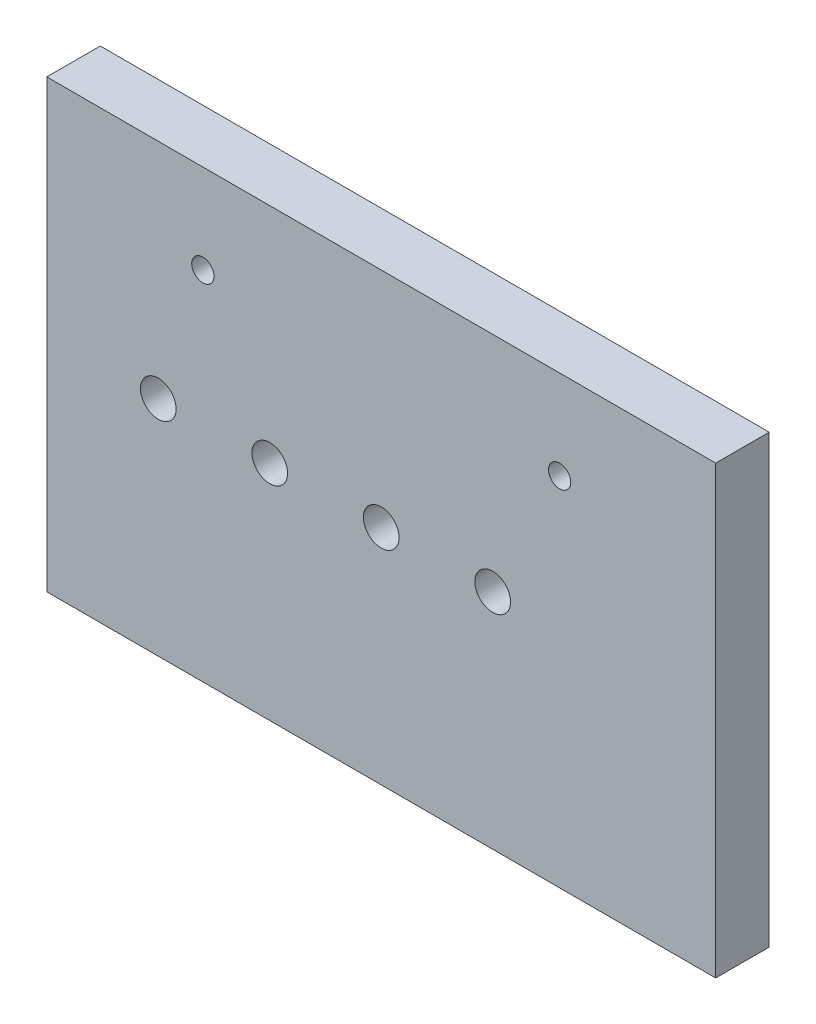
ISO-10303-21;
HEADER;
FILE_DESCRIPTION(('STEP AP214'),'2;1');
FILE_NAME('part.step','',(''),(''),'','','');
FILE_SCHEMA(('AUTOMOTIVE_DESIGN { 1 0 10303 214 1 1 1 1 }'));
ENDSEC;
DATA;
#1=APPLICATION_CONTEXT('core data for automotive mechanical design processes');
#2=APPLICATION_PROTOCOL_DEFINITION('international standard','automotive_design',2000,#1);
#3=PRODUCT_CONTEXT('',#1,'mechanical');
#4=PRODUCT('Part','Part','',(#3));
#5=PRODUCT_RELATED_PRODUCT_CATEGORY('part','',(#4));
#6=PRODUCT_DEFINITION_FORMATION('','',#4);
#7=PRODUCT_DEFINITION_CONTEXT('part definition',#1,'design');
#8=PRODUCT_DEFINITION('design','',#6,#7);
#9=PRODUCT_DEFINITION_SHAPE('','',#8);
#10=(LENGTH_UNIT() NAMED_UNIT(*) SI_UNIT(.MILLI.,.METRE.));
#11=(NAMED_UNIT(*) PLANE_ANGLE_UNIT() SI_UNIT($,.RADIAN.));
#12=(NAMED_UNIT(*) SI_UNIT($,.STERADIAN.) SOLID_ANGLE_UNIT());
#13=UNCERTAINTY_MEASURE_WITH_UNIT(LENGTH_MEASURE(1.E-05),#10,'distance_accuracy_value','');
#14=(GEOMETRIC_REPRESENTATION_CONTEXT(3) GLOBAL_UNCERTAINTY_ASSIGNED_CONTEXT((#13)) GLOBAL_UNIT_ASSIGNED_CONTEXT((#10,
#11,#12)) REPRESENTATION_CONTEXT('',''));
#15=CARTESIAN_POINT('',(0.,0.,0.));
#16=DIRECTION('',(0.,0.,1.));
#17=DIRECTION('',(1.,0.,0.));
#18=AXIS2_PLACEMENT_3D('',#15,#16,#17);
#19=CARTESIAN_POINT('',(40.,30.,0.));
#20=DIRECTION('',(0.,0.,-1.));
#21=DIRECTION('',(1.,0.,0.));
#22=AXIS2_PLACEMENT_3D('',#19,#20,#21);
#23=CYLINDRICAL_SURFACE('',#22,2.5);
#24=CARTESIAN_POINT('',(40.,30.,0.));
#25=DIRECTION('',(0.,0.,1.));
#26=DIRECTION('',(1.,0.,0.));
#27=AXIS2_PLACEMENT_3D('',#24,#25,#26);
#28=CIRCLE('',#27,2.5);
#29=CARTESIAN_POINT('',(42.5,30.,0.));
#30=VERTEX_POINT('',#29);
#31=EDGE_CURVE('E222',#30,#30,#28,.T.);
#32=ORIENTED_EDGE('',*,*,#31,.F.);
#33=DIRECTION('',(0.,0.,1.));
#34=VECTOR('',#33,1.);
#35=CARTESIAN_POINT('',(42.5,30.,0.));
#36=LINE('',#35,#34);
#37=CARTESIAN_POINT('',(42.5,30.,12.));
#38=VERTEX_POINT('',#37);
#39=EDGE_CURVE('E10',#30,#38,#36,.T.);
#40=ORIENTED_EDGE('',*,*,#39,.T.);
#41=CARTESIAN_POINT('',(40.,30.,12.));
#42=DIRECTION('',(0.,0.,-1.));
#43=DIRECTION('',(1.,0.,0.));
#44=AXIS2_PLACEMENT_3D('',#41,#42,#43);
#45=CIRCLE('',#44,2.5);
#46=EDGE_CURVE('E152',#38,#38,#45,.T.);
#47=ORIENTED_EDGE('',*,*,#46,.F.);
#48=ORIENTED_EDGE('',*,*,#39,.F.);
#49=EDGE_LOOP('',(#32,#40,#47,#48));
#50=FACE_BOUND('',#49,.T.);
#51=ADVANCED_FACE('F16',(#50),#23,.F.);
#52=CARTESIAN_POINT('',(-40.,30.,0.));
#53=DIRECTION('',(0.,0.,-1.));
#54=DIRECTION('',(1.,0.,0.));
#55=AXIS2_PLACEMENT_3D('',#52,#53,#54);
#56=CYLINDRICAL_SURFACE('',#55,2.5);
#57=CARTESIAN_POINT('',(-40.,30.,0.));
#58=DIRECTION('',(0.,0.,1.));
#59=DIRECTION('',(1.,0.,0.));
#60=AXIS2_PLACEMENT_3D('',#57,#58,#59);
#61=CIRCLE('',#60,2.5);
#62=CARTESIAN_POINT('',(-37.5,30.,0.));
#63=VERTEX_POINT('',#62);
#64=EDGE_CURVE('E218',#63,#63,#61,.T.);
#65=ORIENTED_EDGE('',*,*,#64,.F.);
#66=DIRECTION('',(0.,0.,1.));
#67=VECTOR('',#66,1.);
#68=CARTESIAN_POINT('',(-37.5,30.,0.));
#69=LINE('',#68,#67);
#70=CARTESIAN_POINT('',(-37.5,30.,12.));
#71=VERTEX_POINT('',#70);
#72=EDGE_CURVE('E24',#63,#71,#69,.T.);
#73=ORIENTED_EDGE('',*,*,#72,.T.);
#74=CARTESIAN_POINT('',(-40.,30.,12.));
#75=DIRECTION('',(0.,0.,-1.));
#76=DIRECTION('',(1.,0.,0.));
#77=AXIS2_PLACEMENT_3D('',#74,#75,#76);
#78=CIRCLE('',#77,2.5);
#79=EDGE_CURVE('E149',#71,#71,#78,.T.);
#80=ORIENTED_EDGE('',*,*,#79,.F.);
#81=ORIENTED_EDGE('',*,*,#72,.F.);
#82=EDGE_LOOP('',(#65,#73,#80,#81));
#83=FACE_BOUND('',#82,.T.);
#84=ADVANCED_FACE('F274',(#83),#56,.F.);
#85=CARTESIAN_POINT('',(25.,0.,0.));
#86=DIRECTION('',(0.,0.,-1.));
#87=DIRECTION('',(1.,0.,0.));
#88=AXIS2_PLACEMENT_3D('',#85,#86,#87);
#89=CYLINDRICAL_SURFACE('',#88,4.);
#90=CARTESIAN_POINT('',(25.,0.,0.));
#91=DIRECTION('',(0.,0.,1.));
#92=DIRECTION('',(1.,0.,0.));
#93=AXIS2_PLACEMENT_3D('',#90,#91,#92);
#94=CIRCLE('',#93,4.);
#95=CARTESIAN_POINT('',(29.,0.,0.));
#96=VERTEX_POINT('',#95);
#97=EDGE_CURVE('E209',#96,#96,#94,.T.);
#98=ORIENTED_EDGE('',*,*,#97,.F.);
#99=DIRECTION('',(0.,0.,1.));
#100=VECTOR('',#99,1.);
#101=CARTESIAN_POINT('',(29.,0.,0.));
#102=LINE('',#101,#100);
#103=CARTESIAN_POINT('',(29.,0.,12.));
#104=VERTEX_POINT('',#103);
#105=EDGE_CURVE('E156',#96,#104,#102,.T.);
#106=ORIENTED_EDGE('',*,*,#105,.T.);
#107=CARTESIAN_POINT('',(25.,0.,12.));
#108=DIRECTION('',(0.,0.,-1.));
#109=DIRECTION('',(1.,0.,0.));
#110=AXIS2_PLACEMENT_3D('',#107,#108,#109);
#111=CIRCLE('',#110,4.);
#112=EDGE_CURVE('E139',#104,#104,#111,.T.);
#113=ORIENTED_EDGE('',*,*,#112,.F.);
#114=ORIENTED_EDGE('',*,*,#105,.F.);
#115=EDGE_LOOP('',(#98,#106,#113,#114));
#116=FACE_BOUND('',#115,.T.);
#117=ADVANCED_FACE('F278',(#116),#89,.F.);
#118=CARTESIAN_POINT('',(0.,0.,0.));
#119=DIRECTION('',(0.,0.,-1.));
#120=DIRECTION('',(1.,0.,0.));
#121=AXIS2_PLACEMENT_3D('',#118,#119,#120);
#122=CYLINDRICAL_SURFACE('',#121,4.);
#123=CARTESIAN_POINT('',(0.,0.,0.));
#124=DIRECTION('',(0.,0.,1.));
#125=DIRECTION('',(1.,0.,0.));
#126=AXIS2_PLACEMENT_3D('',#123,#124,#125);
#127=CIRCLE('',#126,4.);
#128=CARTESIAN_POINT('',(4.,0.,0.));
#129=VERTEX_POINT('',#128);
#130=EDGE_CURVE('E205',#129,#129,#127,.T.);
#131=ORIENTED_EDGE('',*,*,#130,.F.);
#132=DIRECTION('',(0.,0.,1.));
#133=VECTOR('',#132,1.);
#134=CARTESIAN_POINT('',(4.,0.,0.));
#135=LINE('',#134,#133);
#136=CARTESIAN_POINT('',(4.,0.,12.));
#137=VERTEX_POINT('',#136);
#138=EDGE_CURVE('E125',#129,#137,#135,.T.);
#139=ORIENTED_EDGE('',*,*,#138,.T.);
#140=CARTESIAN_POINT('',(0.,0.,12.));
#141=DIRECTION('',(0.,0.,-1.));
#142=DIRECTION('',(1.,0.,0.));
#143=AXIS2_PLACEMENT_3D('',#140,#141,#142);
#144=CIRCLE('',#143,4.);
#145=EDGE_CURVE('E132',#137,#137,#144,.T.);
#146=ORIENTED_EDGE('',*,*,#145,.F.);
#147=ORIENTED_EDGE('',*,*,#138,.F.);
#148=EDGE_LOOP('',(#131,#139,#146,#147));
#149=FACE_BOUND('',#148,.T.);
#150=ADVANCED_FACE('F282',(#149),#122,.F.);
#151=CARTESIAN_POINT('',(-25.,0.,0.));
#152=DIRECTION('',(0.,0.,-1.));
#153=DIRECTION('',(1.,0.,0.));
#154=AXIS2_PLACEMENT_3D('',#151,#152,#153);
#155=CYLINDRICAL_SURFACE('',#154,4.);
#156=CARTESIAN_POINT('',(-25.,0.,0.));
#157=DIRECTION('',(0.,0.,1.));
#158=DIRECTION('',(1.,0.,0.));
#159=AXIS2_PLACEMENT_3D('',#156,#157,#158);
#160=CIRCLE('',#159,4.);
#161=CARTESIAN_POINT('',(-21.,0.,0.));
#162=VERTEX_POINT('',#161);
#163=EDGE_CURVE('E123',#162,#162,#160,.T.);
#164=ORIENTED_EDGE('',*,*,#163,.F.);
#165=DIRECTION('',(0.,0.,1.));
#166=VECTOR('',#165,1.);
#167=CARTESIAN_POINT('',(-21.,0.,0.));
#168=LINE('',#167,#166);
#169=CARTESIAN_POINT('',(-21.,0.,12.));
#170=VERTEX_POINT('',#169);
#171=EDGE_CURVE('E118',#162,#170,#168,.T.);
#172=ORIENTED_EDGE('',*,*,#171,.T.);
#173=CARTESIAN_POINT('',(-25.,0.,12.));
#174=DIRECTION('',(0.,0.,-1.));
#175=DIRECTION('',(1.,0.,0.));
#176=AXIS2_PLACEMENT_3D('',#173,#174,#175);
#177=CIRCLE('',#176,4.);
#178=EDGE_CURVE('E121',#170,#170,#177,.T.);
#179=ORIENTED_EDGE('',*,*,#178,.F.);
#180=ORIENTED_EDGE('',*,*,#171,.F.);
#181=EDGE_LOOP('',(#164,#172,#179,#180));
#182=FACE_BOUND('',#181,.T.);
#183=ADVANCED_FACE('F120',(#182),#155,.F.);
#184=CARTESIAN_POINT('',(-50.,0.,0.));
#185=DIRECTION('',(0.,0.,-1.));
#186=DIRECTION('',(1.,0.,0.));
#187=AXIS2_PLACEMENT_3D('',#184,#185,#186);
#188=CYLINDRICAL_SURFACE('',#187,4.);
#189=CARTESIAN_POINT('',(-50.,0.,0.));
#190=DIRECTION('',(0.,0.,1.));
#191=DIRECTION('',(1.,0.,0.));
#192=AXIS2_PLACEMENT_3D('',#189,#190,#191);
#193=CIRCLE('',#192,4.);
#194=CARTESIAN_POINT('',(-46.,0.,0.));
#195=VERTEX_POINT('',#194);
#196=EDGE_CURVE('E210',#195,#195,#193,.T.);
#197=ORIENTED_EDGE('',*,*,#196,.F.);
#198=DIRECTION('',(0.,0.,1.));
#199=VECTOR('',#198,1.);
#200=CARTESIAN_POINT('',(-46.,0.,0.));
#201=LINE('',#200,#199);
#202=CARTESIAN_POINT('',(-46.,0.,12.));
#203=VERTEX_POINT('',#202);
#204=EDGE_CURVE('E126',#195,#203,#201,.T.);
#205=ORIENTED_EDGE('',*,*,#204,.T.);
#206=CARTESIAN_POINT('',(-50.,0.,12.));
#207=DIRECTION('',(0.,0.,-1.));
#208=DIRECTION('',(1.,0.,0.));
#209=AXIS2_PLACEMENT_3D('',#206,#207,#208);
#210=CIRCLE('',#209,4.);
#211=EDGE_CURVE('E133',#203,#203,#210,.T.);
#212=ORIENTED_EDGE('',*,*,#211,.F.);
#213=ORIENTED_EDGE('',*,*,#204,.F.);
#214=EDGE_LOOP('',(#197,#205,#212,#213));
#215=FACE_BOUND('',#214,.T.);
#216=ADVANCED_FACE('F288',(#215),#188,.F.);
#217=CARTESIAN_POINT('',(75.,50.,0.));
#218=DIRECTION('',(0.,-1.,0.));
#219=DIRECTION('',(0.,0.,-1.));
#220=AXIS2_PLACEMENT_3D('',#217,#218,#219);
#221=PLANE('',#220);
#222=DIRECTION('',(-1.,0.,0.));
#223=VECTOR('',#222,1.);
#224=CARTESIAN_POINT('',(75.,50.,0.));
#225=LINE('',#224,#223);
#226=CARTESIAN_POINT('',(75.,50.,0.));
#227=VERTEX_POINT('',#226);
#228=CARTESIAN_POINT('',(-75.,50.,0.));
#229=VERTEX_POINT('',#228);
#230=EDGE_CURVE('E204',#227,#229,#225,.T.);
#231=ORIENTED_EDGE('',*,*,#230,.T.);
#232=DIRECTION('',(0.,0.,1.));
#233=VECTOR('',#232,1.);
#234=CARTESIAN_POINT('',(-75.,50.,0.));
#235=LINE('',#234,#233);
#236=CARTESIAN_POINT('',(-75.,50.,12.));
#237=VERTEX_POINT('',#236);
#238=EDGE_CURVE('E191',#229,#237,#235,.T.);
#239=ORIENTED_EDGE('',*,*,#238,.T.);
#240=DIRECTION('',(-1.,0.,0.));
#241=VECTOR('',#240,1.);
#242=CARTESIAN_POINT('',(75.,50.,12.));
#243=LINE('',#242,#241);
#244=CARTESIAN_POINT('',(75.,50.,12.));
#245=VERTEX_POINT('',#244);
#246=EDGE_CURVE('E142',#245,#237,#243,.T.);
#247=ORIENTED_EDGE('',*,*,#246,.F.);
#248=DIRECTION('',(0.,0.,1.));
#249=VECTOR('',#248,1.);
#250=CARTESIAN_POINT('',(75.,50.,0.));
#251=LINE('',#250,#249);
#252=EDGE_CURVE('E196',#227,#245,#251,.T.);
#253=ORIENTED_EDGE('',*,*,#252,.F.);
#254=EDGE_LOOP('',(#231,#239,#247,#253));
#255=FACE_BOUND('',#254,.T.);
#256=ADVANCED_FACE('F236',(#255),#221,.F.);
#257=CARTESIAN_POINT('',(0.,0.,12.));
#258=DIRECTION('',(0.,0.,1.));
#259=DIRECTION('',(1.,0.,0.));
#260=AXIS2_PLACEMENT_3D('',#257,#258,#259);
#261=PLANE('',#260);
#262=ORIENTED_EDGE('',*,*,#46,.T.);
#263=EDGE_LOOP('',(#262));
#264=FACE_BOUND('',#263,.T.);
#265=ORIENTED_EDGE('',*,*,#79,.T.);
#266=EDGE_LOOP('',(#265));
#267=FACE_BOUND('',#266,.T.);
#268=ORIENTED_EDGE('',*,*,#112,.T.);
#269=EDGE_LOOP('',(#268));
#270=FACE_BOUND('',#269,.T.);
#271=ORIENTED_EDGE('',*,*,#145,.T.);
#272=EDGE_LOOP('',(#271));
#273=FACE_BOUND('',#272,.T.);
#274=ORIENTED_EDGE('',*,*,#178,.T.);
#275=EDGE_LOOP('',(#274));
#276=FACE_BOUND('',#275,.T.);
#277=ORIENTED_EDGE('',*,*,#211,.T.);
#278=EDGE_LOOP('',(#277));
#279=FACE_BOUND('',#278,.T.);
#280=DIRECTION('',(1.,0.,0.));
#281=VECTOR('',#280,1.);
#282=CARTESIAN_POINT('',(-75.,-50.,12.));
#283=LINE('',#282,#281);
#284=CARTESIAN_POINT('',(-75.,-50.,12.));
#285=VERTEX_POINT('',#284);
#286=CARTESIAN_POINT('',(75.,-50.,12.));
#287=VERTEX_POINT('',#286);
#288=EDGE_CURVE('E176',#285,#287,#283,.T.);
#289=ORIENTED_EDGE('',*,*,#288,.T.);
#290=DIRECTION('',(0.,1.,0.));
#291=VECTOR('',#290,1.);
#292=CARTESIAN_POINT('',(75.,-50.,12.));
#293=LINE('',#292,#291);
#294=EDGE_CURVE('E200',#287,#245,#293,.T.);
#295=ORIENTED_EDGE('',*,*,#294,.T.);
#296=ORIENTED_EDGE('',*,*,#246,.T.);
#297=DIRECTION('',(0.,-1.,0.));
#298=VECTOR('',#297,1.);
#299=CARTESIAN_POINT('',(-75.,50.,12.));
#300=LINE('',#299,#298);
#301=EDGE_CURVE('E185',#237,#285,#300,.T.);
#302=ORIENTED_EDGE('',*,*,#301,.T.);
#303=EDGE_LOOP('',(#289,#295,#296,#302));
#304=FACE_BOUND('',#303,.T.);
#305=ADVANCED_FACE('F129',(#264,#267,#270,#273,#276,#279,#304),#261,.T.);
#306=CARTESIAN_POINT('',(0.,0.,0.));
#307=DIRECTION('',(0.,0.,1.));
#308=DIRECTION('',(1.,0.,0.));
#309=AXIS2_PLACEMENT_3D('',#306,#307,#308);
#310=PLANE('',#309);
#311=ORIENTED_EDGE('',*,*,#31,.T.);
#312=EDGE_LOOP('',(#311));
#313=FACE_BOUND('',#312,.T.);
#314=ORIENTED_EDGE('',*,*,#64,.T.);
#315=EDGE_LOOP('',(#314));
#316=FACE_BOUND('',#315,.T.);
#317=ORIENTED_EDGE('',*,*,#97,.T.);
#318=EDGE_LOOP('',(#317));
#319=FACE_BOUND('',#318,.T.);
#320=ORIENTED_EDGE('',*,*,#130,.T.);
#321=EDGE_LOOP('',(#320));
#322=FACE_BOUND('',#321,.T.);
#323=ORIENTED_EDGE('',*,*,#163,.T.);
#324=EDGE_LOOP('',(#323));
#325=FACE_BOUND('',#324,.T.);
#326=ORIENTED_EDGE('',*,*,#196,.T.);
#327=EDGE_LOOP('',(#326));
#328=FACE_BOUND('',#327,.T.);
#329=DIRECTION('',(0.,-1.,0.));
#330=VECTOR('',#329,1.);
#331=CARTESIAN_POINT('',(-75.,50.,0.));
#332=LINE('',#331,#330);
#333=CARTESIAN_POINT('',(-75.,-50.,0.));
#334=VERTEX_POINT('',#333);
#335=EDGE_CURVE('E182',#229,#334,#332,.T.);
#336=ORIENTED_EDGE('',*,*,#335,.F.);
#337=ORIENTED_EDGE('',*,*,#230,.F.);
#338=DIRECTION('',(0.,1.,0.));
#339=VECTOR('',#338,1.);
#340=CARTESIAN_POINT('',(75.,-50.,0.));
#341=LINE('',#340,#339);
#342=CARTESIAN_POINT('',(75.,-50.,0.));
#343=VERTEX_POINT('',#342);
#344=EDGE_CURVE('E192',#343,#227,#341,.T.);
#345=ORIENTED_EDGE('',*,*,#344,.F.);
#346=DIRECTION('',(1.,0.,0.));
#347=VECTOR('',#346,1.);
#348=CARTESIAN_POINT('',(-75.,-50.,0.));
#349=LINE('',#348,#347);
#350=EDGE_CURVE('E177',#334,#343,#349,.T.);
#351=ORIENTED_EDGE('',*,*,#350,.F.);
#352=EDGE_LOOP('',(#336,#337,#345,#351));
#353=FACE_BOUND('',#352,.T.);
#354=ADVANCED_FACE('F251',(#313,#316,#319,#322,#325,#328,#353),#310,.F.);
#355=CARTESIAN_POINT('',(75.,-50.,0.));
#356=DIRECTION('',(-1.,0.,0.));
#357=DIRECTION('',(0.,0.,1.));
#358=AXIS2_PLACEMENT_3D('',#355,#356,#357);
#359=PLANE('',#358);
#360=ORIENTED_EDGE('',*,*,#344,.T.);
#361=ORIENTED_EDGE('',*,*,#252,.T.);
#362=ORIENTED_EDGE('',*,*,#294,.F.);
#363=DIRECTION('',(0.,0.,1.));
#364=VECTOR('',#363,1.);
#365=CARTESIAN_POINT('',(75.,-50.,0.));
#366=LINE('',#365,#364);
#367=EDGE_CURVE('E173',#343,#287,#366,.T.);
#368=ORIENTED_EDGE('',*,*,#367,.F.);
#369=EDGE_LOOP('',(#360,#361,#362,#368));
#370=FACE_BOUND('',#369,.T.);
#371=ADVANCED_FACE('F249',(#370),#359,.F.);
#372=CARTESIAN_POINT('',(-75.,50.,0.));
#373=DIRECTION('',(1.,0.,0.));
#374=DIRECTION('',(0.,1.,0.));
#375=AXIS2_PLACEMENT_3D('',#372,#373,#374);
#376=PLANE('',#375);
#377=ORIENTED_EDGE('',*,*,#335,.T.);
#378=DIRECTION('',(0.,0.,1.));
#379=VECTOR('',#378,1.);
#380=CARTESIAN_POINT('',(-75.,-50.,0.));
#381=LINE('',#380,#379);
#382=EDGE_CURVE('E181',#334,#285,#381,.T.);
#383=ORIENTED_EDGE('',*,*,#382,.T.);
#384=ORIENTED_EDGE('',*,*,#301,.F.);
#385=ORIENTED_EDGE('',*,*,#238,.F.);
#386=EDGE_LOOP('',(#377,#383,#384,#385));
#387=FACE_BOUND('',#386,.T.);
#388=ADVANCED_FACE('F240',(#387),#376,.F.);
#389=CARTESIAN_POINT('',(-75.,-50.,0.));
#390=DIRECTION('',(0.,1.,0.));
#391=DIRECTION('',(1.,0.,0.));
#392=AXIS2_PLACEMENT_3D('',#389,#390,#391);
#393=PLANE('',#392);
#394=ORIENTED_EDGE('',*,*,#350,.T.);
#395=ORIENTED_EDGE('',*,*,#367,.T.);
#396=ORIENTED_EDGE('',*,*,#288,.F.);
#397=ORIENTED_EDGE('',*,*,#382,.F.);
#398=EDGE_LOOP('',(#394,#395,#396,#397));
#399=FACE_BOUND('',#398,.T.);
#400=ADVANCED_FACE('F246',(#399),#393,.F.);
#401=CLOSED_SHELL('',(#51,#84,#117,#150,#183,#216,#256,#305,#354,#371,#388,#400));
#402=MANIFOLD_SOLID_BREP('B1',#401);
#403=ADVANCED_BREP_SHAPE_REPRESENTATION('',(#18,#402),#14);
#404=SHAPE_DEFINITION_REPRESENTATION(#9,#403);
ENDSEC;
END-ISO-10303-21;
